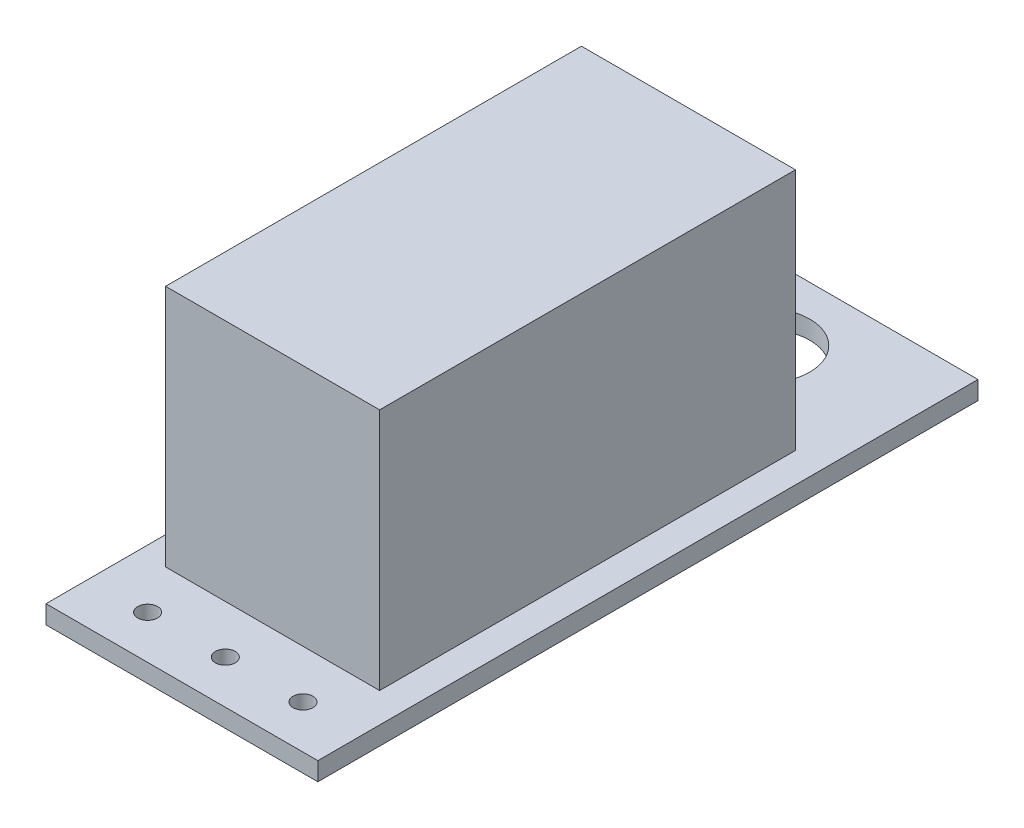
ISO-10303-21;
HEADER;
FILE_DESCRIPTION(('STEP AP214'),'2;1');
FILE_NAME('part.step','',(''),(''),'','','');
FILE_SCHEMA(('AUTOMOTIVE_DESIGN { 1 0 10303 214 1 1 1 1 }'));
ENDSEC;
DATA;
#1=APPLICATION_CONTEXT('core data for automotive mechanical design processes');
#2=APPLICATION_PROTOCOL_DEFINITION('international standard','automotive_design',2000,#1);
#3=PRODUCT_CONTEXT('',#1,'mechanical');
#4=PRODUCT('Part','Part','',(#3));
#5=PRODUCT_RELATED_PRODUCT_CATEGORY('part','',(#4));
#6=PRODUCT_DEFINITION_FORMATION('','',#4);
#7=PRODUCT_DEFINITION_CONTEXT('part definition',#1,'design');
#8=PRODUCT_DEFINITION('design','',#6,#7);
#9=PRODUCT_DEFINITION_SHAPE('','',#8);
#10=(LENGTH_UNIT() NAMED_UNIT(*) SI_UNIT(.MILLI.,.METRE.));
#11=(NAMED_UNIT(*) PLANE_ANGLE_UNIT() SI_UNIT($,.RADIAN.));
#12=(NAMED_UNIT(*) SI_UNIT($,.STERADIAN.) SOLID_ANGLE_UNIT());
#13=UNCERTAINTY_MEASURE_WITH_UNIT(LENGTH_MEASURE(1.E-05),#10,'distance_accuracy_value','');
#14=(GEOMETRIC_REPRESENTATION_CONTEXT(3) GLOBAL_UNCERTAINTY_ASSIGNED_CONTEXT((#13)) GLOBAL_UNIT_ASSIGNED_CONTEXT((#10,
#11,#12)) REPRESENTATION_CONTEXT('',''));
#15=CARTESIAN_POINT('',(0.,0.,0.));
#16=DIRECTION('',(0.,0.,1.));
#17=DIRECTION('',(1.,0.,0.));
#18=AXIS2_PLACEMENT_3D('',#15,#16,#17);
#19=CARTESIAN_POINT('',(3.5,7.95,6.8));
#20=DIRECTION('',(-1.,0.,0.));
#21=DIRECTION('',(0.,0.,1.));
#22=AXIS2_PLACEMENT_3D('',#19,#20,#21);
#23=PLANE('',#22);
#24=DIRECTION('',(0.,0.,-1.));
#25=VECTOR('',#24,1.);
#26=CARTESIAN_POINT('',(3.5,0.,6.8));
#27=LINE('',#26,#25);
#28=CARTESIAN_POINT('',(3.5,0.,6.8));
#29=VERTEX_POINT('',#28);
#30=CARTESIAN_POINT('',(3.5,0.,-6.8));
#31=VERTEX_POINT('',#30);
#32=EDGE_CURVE('E118',#29,#31,#27,.T.);
#33=ORIENTED_EDGE('',*,*,#32,.T.);
#34=DIRECTION('',(0.,-1.,0.));
#35=VECTOR('',#34,1.);
#36=CARTESIAN_POINT('',(3.5,7.95,-6.8));
#37=LINE('',#36,#35);
#38=CARTESIAN_POINT('',(3.5,7.95,-6.8));
#39=VERTEX_POINT('',#38);
#40=EDGE_CURVE('E11',#39,#31,#37,.T.);
#41=ORIENTED_EDGE('',*,*,#40,.F.);
#42=DIRECTION('',(0.,0.,-1.));
#43=VECTOR('',#42,1.);
#44=CARTESIAN_POINT('',(3.5,7.95,6.8));
#45=LINE('',#44,#43);
#46=CARTESIAN_POINT('',(3.5,7.95,6.8));
#47=VERTEX_POINT('',#46);
#48=EDGE_CURVE('E127',#47,#39,#45,.T.);
#49=ORIENTED_EDGE('',*,*,#48,.F.);
#50=DIRECTION('',(0.,-1.,0.));
#51=VECTOR('',#50,1.);
#52=CARTESIAN_POINT('',(3.5,7.95,6.8));
#53=LINE('',#52,#51);
#54=EDGE_CURVE('E134',#47,#29,#53,.T.);
#55=ORIENTED_EDGE('',*,*,#54,.T.);
#56=EDGE_LOOP('',(#33,#41,#49,#55));
#57=FACE_BOUND('',#56,.T.);
#58=ADVANCED_FACE('F32',(#57),#23,.F.);
#59=CARTESIAN_POINT('',(-3.5,7.95,-6.8));
#60=DIRECTION('',(0.,0.,1.));
#61=DIRECTION('',(1.,0.,0.));
#62=AXIS2_PLACEMENT_3D('',#59,#60,#61);
#63=PLANE('',#62);
#64=DIRECTION('',(-1.,0.,0.));
#65=VECTOR('',#64,1.);
#66=CARTESIAN_POINT('',(-3.5,0.,-6.8));
#67=LINE('',#66,#65);
#68=CARTESIAN_POINT('',(-3.5,0.,-6.8));
#69=VERTEX_POINT('',#68);
#70=EDGE_CURVE('E121',#31,#69,#67,.T.);
#71=ORIENTED_EDGE('',*,*,#70,.T.);
#72=DIRECTION('',(0.,-1.,0.));
#73=VECTOR('',#72,1.);
#74=CARTESIAN_POINT('',(-3.5,7.95,-6.8));
#75=LINE('',#74,#73);
#76=CARTESIAN_POINT('',(-3.5,7.95,-6.8));
#77=VERTEX_POINT('',#76);
#78=EDGE_CURVE('E40',#77,#69,#75,.T.);
#79=ORIENTED_EDGE('',*,*,#78,.F.);
#80=DIRECTION('',(-1.,0.,0.));
#81=VECTOR('',#80,1.);
#82=CARTESIAN_POINT('',(-3.5,7.95,-6.8));
#83=LINE('',#82,#81);
#84=EDGE_CURVE('E129',#39,#77,#83,.T.);
#85=ORIENTED_EDGE('',*,*,#84,.F.);
#86=ORIENTED_EDGE('',*,*,#40,.T.);
#87=EDGE_LOOP('',(#71,#79,#85,#86));
#88=FACE_BOUND('',#87,.T.);
#89=ADVANCED_FACE('F154',(#88),#63,.F.);
#90=CARTESIAN_POINT('',(-3.5,7.95,6.8));
#91=DIRECTION('',(1.,0.,0.));
#92=DIRECTION('',(0.,0.,-1.));
#93=AXIS2_PLACEMENT_3D('',#90,#91,#92);
#94=PLANE('',#93);
#95=DIRECTION('',(0.,0.,1.));
#96=VECTOR('',#95,1.);
#97=CARTESIAN_POINT('',(-3.5,0.,6.8));
#98=LINE('',#97,#96);
#99=CARTESIAN_POINT('',(-3.5,0.,6.8));
#100=VERTEX_POINT('',#99);
#101=EDGE_CURVE('E138',#69,#100,#98,.T.);
#102=ORIENTED_EDGE('',*,*,#101,.T.);
#103=DIRECTION('',(0.,-1.,0.));
#104=VECTOR('',#103,1.);
#105=CARTESIAN_POINT('',(-3.5,7.95,6.8));
#106=LINE('',#105,#104);
#107=CARTESIAN_POINT('',(-3.5,7.95,6.8));
#108=VERTEX_POINT('',#107);
#109=EDGE_CURVE('E145',#108,#100,#106,.T.);
#110=ORIENTED_EDGE('',*,*,#109,.F.);
#111=DIRECTION('',(0.,0.,1.));
#112=VECTOR('',#111,1.);
#113=CARTESIAN_POINT('',(-3.5,7.95,6.8));
#114=LINE('',#113,#112);
#115=EDGE_CURVE('E132',#77,#108,#114,.T.);
#116=ORIENTED_EDGE('',*,*,#115,.F.);
#117=ORIENTED_EDGE('',*,*,#78,.T.);
#118=EDGE_LOOP('',(#102,#110,#116,#117));
#119=FACE_BOUND('',#118,.T.);
#120=ADVANCED_FACE('F151',(#119),#94,.F.);
#121=CARTESIAN_POINT('',(-3.5,7.95,6.8));
#122=DIRECTION('',(0.,0.,-1.));
#123=DIRECTION('',(-1.,0.,0.));
#124=AXIS2_PLACEMENT_3D('',#121,#122,#123);
#125=PLANE('',#124);
#126=DIRECTION('',(1.,0.,0.));
#127=VECTOR('',#126,1.);
#128=CARTESIAN_POINT('',(-3.5,0.,6.8));
#129=LINE('',#128,#127);
#130=EDGE_CURVE('E130',#100,#29,#129,.T.);
#131=ORIENTED_EDGE('',*,*,#130,.T.);
#132=ORIENTED_EDGE('',*,*,#54,.F.);
#133=DIRECTION('',(1.,0.,0.));
#134=VECTOR('',#133,1.);
#135=CARTESIAN_POINT('',(-3.5,7.95,6.8));
#136=LINE('',#135,#134);
#137=EDGE_CURVE('E47',#108,#47,#136,.T.);
#138=ORIENTED_EDGE('',*,*,#137,.F.);
#139=ORIENTED_EDGE('',*,*,#109,.T.);
#140=EDGE_LOOP('',(#131,#132,#138,#139));
#141=FACE_BOUND('',#140,.T.);
#142=ADVANCED_FACE('F160',(#141),#125,.F.);
#143=CARTESIAN_POINT('',(0.,7.95,0.));
#144=DIRECTION('',(0.,-1.,0.));
#145=DIRECTION('',(0.,0.,-1.));
#146=AXIS2_PLACEMENT_3D('',#143,#144,#145);
#147=PLANE('',#146);
#148=ORIENTED_EDGE('',*,*,#48,.T.);
#149=ORIENTED_EDGE('',*,*,#84,.T.);
#150=ORIENTED_EDGE('',*,*,#115,.T.);
#151=ORIENTED_EDGE('',*,*,#137,.T.);
#152=EDGE_LOOP('',(#148,#149,#150,#151));
#153=FACE_BOUND('',#152,.T.);
#154=ADVANCED_FACE('F163',(#153),#147,.F.);
#155=CARTESIAN_POINT('',(0.,0.,0.));
#156=DIRECTION('',(0.,-1.,0.));
#157=DIRECTION('',(0.,0.,-1.));
#158=AXIS2_PLACEMENT_3D('',#155,#156,#157);
#159=PLANE('',#158);
#160=DIRECTION('',(0.,0.,1.));
#161=VECTOR('',#160,1.);
#162=CARTESIAN_POINT('',(4.47444532179176,0.,9.79543360749544));
#163=LINE('',#162,#161);
#164=CARTESIAN_POINT('',(4.47444532179177,0.,-11.7945663925046));
#165=VERTEX_POINT('',#164);
#166=CARTESIAN_POINT('',(4.47444532179176,0.,9.79543360749544));
#167=VERTEX_POINT('',#166);
#168=EDGE_CURVE('E117',#165,#167,#163,.T.);
#169=ORIENTED_EDGE('',*,*,#168,.F.);
#170=DIRECTION('',(1.,0.,0.));
#171=VECTOR('',#170,1.);
#172=CARTESIAN_POINT('',(-4.41555467820823,0.,-11.7945663925046));
#173=LINE('',#172,#171);
#174=CARTESIAN_POINT('',(-4.41555467820823,0.,-11.7945663925046));
#175=VERTEX_POINT('',#174);
#176=EDGE_CURVE('E113',#175,#165,#173,.T.);
#177=ORIENTED_EDGE('',*,*,#176,.F.);
#178=DIRECTION('',(0.,0.,-1.));
#179=VECTOR('',#178,1.);
#180=CARTESIAN_POINT('',(-4.41555467820824,0.,9.79543360749544));
#181=LINE('',#180,#179);
#182=CARTESIAN_POINT('',(-4.41555467820824,0.,9.79543360749544));
#183=VERTEX_POINT('',#182);
#184=EDGE_CURVE('E318',#183,#175,#181,.T.);
#185=ORIENTED_EDGE('',*,*,#184,.F.);
#186=DIRECTION('',(-1.,0.,0.));
#187=VECTOR('',#186,1.);
#188=CARTESIAN_POINT('',(-4.41555467820824,0.,9.79543360749544));
#189=LINE('',#188,#187);
#190=EDGE_CURVE('E316',#167,#183,#189,.T.);
#191=ORIENTED_EDGE('',*,*,#190,.F.);
#192=EDGE_LOOP('',(#169,#177,#185,#191));
#193=FACE_BOUND('',#192,.T.);
#194=CARTESIAN_POINT('',(0.0150112496129703,0.,-9.25456639250456));
#195=DIRECTION('',(0.,-1.,0.));
#196=DIRECTION('',(0.,0.,-1.));
#197=AXIS2_PLACEMENT_3D('',#194,#195,#196);
#198=CIRCLE('',#197,1.5);
#199=CARTESIAN_POINT('',(0.0150112496129703,0.,-10.7545663925046));
#200=VERTEX_POINT('',#199);
#201=EDGE_CURVE('E304',#200,#200,#198,.T.);
#202=ORIENTED_EDGE('',*,*,#201,.T.);
#203=EDGE_LOOP('',(#202));
#204=FACE_BOUND('',#203,.T.);
#205=CARTESIAN_POINT('',(0.0294453217917632,0.,8.37656057136997));
#206=DIRECTION('',(0.,-1.,0.));
#207=DIRECTION('',(0.,0.,-1.));
#208=AXIS2_PLACEMENT_3D('',#205,#206,#207);
#209=CIRCLE('',#208,0.325000000000001);
#210=CARTESIAN_POINT('',(0.0294453217917632,0.,8.05156057136997));
#211=VERTEX_POINT('',#210);
#212=EDGE_CURVE('E298',#211,#211,#209,.T.);
#213=ORIENTED_EDGE('',*,*,#212,.T.);
#214=EDGE_LOOP('',(#213));
#215=FACE_BOUND('',#214,.T.);
#216=CARTESIAN_POINT('',(2.56944532179176,0.,8.37656057136997));
#217=DIRECTION('',(0.,-1.,0.));
#218=DIRECTION('',(0.,0.,-1.));
#219=AXIS2_PLACEMENT_3D('',#216,#217,#218);
#220=CIRCLE('',#219,0.325000000000001);
#221=CARTESIAN_POINT('',(2.56944532179176,0.,8.05156057136997));
#222=VERTEX_POINT('',#221);
#223=EDGE_CURVE('E292',#222,#222,#220,.T.);
#224=ORIENTED_EDGE('',*,*,#223,.T.);
#225=EDGE_LOOP('',(#224));
#226=FACE_BOUND('',#225,.T.);
#227=CARTESIAN_POINT('',(-2.51055467820824,0.,8.37656057136997));
#228=DIRECTION('',(0.,-1.,0.));
#229=DIRECTION('',(0.,0.,-1.));
#230=AXIS2_PLACEMENT_3D('',#227,#228,#229);
#231=CIRCLE('',#230,0.325000000000001);
#232=CARTESIAN_POINT('',(-2.51055467820824,0.,8.05156057136997));
#233=VERTEX_POINT('',#232);
#234=EDGE_CURVE('E289',#233,#233,#231,.T.);
#235=ORIENTED_EDGE('',*,*,#234,.T.);
#236=EDGE_LOOP('',(#235));
#237=FACE_BOUND('',#236,.T.);
#238=ORIENTED_EDGE('',*,*,#70,.F.);
#239=ORIENTED_EDGE('',*,*,#32,.F.);
#240=ORIENTED_EDGE('',*,*,#130,.F.);
#241=ORIENTED_EDGE('',*,*,#101,.F.);
#242=EDGE_LOOP('',(#238,#239,#240,#241));
#243=FACE_BOUND('',#242,.T.);
#244=ADVANCED_FACE('F158',(#193,#204,#215,#226,#237,#243),#159,.F.);
#245=CARTESIAN_POINT('',(0.,-0.6,0.));
#246=DIRECTION('',(0.,-1.,0.));
#247=DIRECTION('',(0.,0.,-1.));
#248=AXIS2_PLACEMENT_3D('',#245,#246,#247);
#249=PLANE('',#248);
#250=CARTESIAN_POINT('',(2.56944532179176,-0.6,8.37656057136997));
#251=DIRECTION('',(0.,-1.,0.));
#252=DIRECTION('',(0.,0.,-1.));
#253=AXIS2_PLACEMENT_3D('',#250,#251,#252);
#254=CIRCLE('',#253,0.325000000000001);
#255=CARTESIAN_POINT('',(2.56944532179176,-0.6,8.05156057136997));
#256=VERTEX_POINT('',#255);
#257=EDGE_CURVE('E295',#256,#256,#254,.T.);
#258=ORIENTED_EDGE('',*,*,#257,.F.);
#259=EDGE_LOOP('',(#258));
#260=FACE_BOUND('',#259,.T.);
#261=CARTESIAN_POINT('',(0.0150112496129703,-0.6,-9.25456639250456));
#262=DIRECTION('',(0.,-1.,0.));
#263=DIRECTION('',(0.,0.,-1.));
#264=AXIS2_PLACEMENT_3D('',#261,#262,#263);
#265=CIRCLE('',#264,1.5);
#266=CARTESIAN_POINT('',(0.0150112496129703,-0.6,-10.7545663925046));
#267=VERTEX_POINT('',#266);
#268=EDGE_CURVE('E307',#267,#267,#265,.T.);
#269=ORIENTED_EDGE('',*,*,#268,.F.);
#270=EDGE_LOOP('',(#269));
#271=FACE_BOUND('',#270,.T.);
#272=DIRECTION('',(0.,0.,1.));
#273=VECTOR('',#272,1.);
#274=CARTESIAN_POINT('',(4.47444532179176,-0.6,9.79543360749544));
#275=LINE('',#274,#273);
#276=CARTESIAN_POINT('',(4.47444532179177,-0.6,-11.7945663925046));
#277=VERTEX_POINT('',#276);
#278=CARTESIAN_POINT('',(4.47444532179176,-0.6,9.79543360749544));
#279=VERTEX_POINT('',#278);
#280=EDGE_CURVE('E103',#277,#279,#275,.T.);
#281=ORIENTED_EDGE('',*,*,#280,.T.);
#282=DIRECTION('',(-1.,0.,0.));
#283=VECTOR('',#282,1.);
#284=CARTESIAN_POINT('',(-4.41555467820824,-0.6,9.79543360749544));
#285=LINE('',#284,#283);
#286=CARTESIAN_POINT('',(-4.41555467820824,-0.6,9.79543360749544));
#287=VERTEX_POINT('',#286);
#288=EDGE_CURVE('E92',#279,#287,#285,.T.);
#289=ORIENTED_EDGE('',*,*,#288,.T.);
#290=DIRECTION('',(0.,0.,-1.));
#291=VECTOR('',#290,1.);
#292=CARTESIAN_POINT('',(-4.41555467820824,-0.6,9.79543360749544));
#293=LINE('',#292,#291);
#294=CARTESIAN_POINT('',(-4.41555467820823,-0.6,-11.7945663925046));
#295=VERTEX_POINT('',#294);
#296=EDGE_CURVE('E102',#287,#295,#293,.T.);
#297=ORIENTED_EDGE('',*,*,#296,.T.);
#298=DIRECTION('',(1.,0.,0.));
#299=VECTOR('',#298,1.);
#300=CARTESIAN_POINT('',(-4.41555467820823,-0.6,-11.7945663925046));
#301=LINE('',#300,#299);
#302=EDGE_CURVE('E109',#295,#277,#301,.T.);
#303=ORIENTED_EDGE('',*,*,#302,.T.);
#304=EDGE_LOOP('',(#281,#289,#297,#303));
#305=FACE_BOUND('',#304,.T.);
#306=CARTESIAN_POINT('',(0.0294453217917632,-0.6,8.37656057136997));
#307=DIRECTION('',(0.,-1.,0.));
#308=DIRECTION('',(0.,0.,-1.));
#309=AXIS2_PLACEMENT_3D('',#306,#307,#308);
#310=CIRCLE('',#309,0.325000000000001);
#311=CARTESIAN_POINT('',(0.0294453217917632,-0.6,8.05156057136997));
#312=VERTEX_POINT('',#311);
#313=EDGE_CURVE('E301',#312,#312,#310,.T.);
#314=ORIENTED_EDGE('',*,*,#313,.F.);
#315=EDGE_LOOP('',(#314));
#316=FACE_BOUND('',#315,.T.);
#317=CARTESIAN_POINT('',(-2.51055467820824,-0.6,8.37656057136997));
#318=DIRECTION('',(0.,-1.,0.));
#319=DIRECTION('',(0.,0.,-1.));
#320=AXIS2_PLACEMENT_3D('',#317,#318,#319);
#321=CIRCLE('',#320,0.325000000000001);
#322=CARTESIAN_POINT('',(-2.51055467820824,-0.6,8.05156057136997));
#323=VERTEX_POINT('',#322);
#324=EDGE_CURVE('E286',#323,#323,#321,.T.);
#325=ORIENTED_EDGE('',*,*,#324,.F.);
#326=EDGE_LOOP('',(#325));
#327=FACE_BOUND('',#326,.T.);
#328=ADVANCED_FACE('F106',(#260,#271,#305,#316,#327),#249,.T.);
#329=CARTESIAN_POINT('',(4.47444532179176,-0.6,9.79543360749544));
#330=DIRECTION('',(-1.,0.,0.));
#331=DIRECTION('',(0.,0.,1.));
#332=AXIS2_PLACEMENT_3D('',#329,#330,#331);
#333=PLANE('',#332);
#334=ORIENTED_EDGE('',*,*,#168,.T.);
#335=DIRECTION('',(0.,1.,0.));
#336=VECTOR('',#335,1.);
#337=CARTESIAN_POINT('',(4.47444532179176,-0.6,9.79543360749544));
#338=LINE('',#337,#336);
#339=EDGE_CURVE('E96',#279,#167,#338,.T.);
#340=ORIENTED_EDGE('',*,*,#339,.F.);
#341=ORIENTED_EDGE('',*,*,#280,.F.);
#342=DIRECTION('',(0.,1.,0.));
#343=VECTOR('',#342,1.);
#344=CARTESIAN_POINT('',(4.47444532179177,-0.6,-11.7945663925046));
#345=LINE('',#344,#343);
#346=EDGE_CURVE('E314',#277,#165,#345,.T.);
#347=ORIENTED_EDGE('',*,*,#346,.T.);
#348=EDGE_LOOP('',(#334,#340,#341,#347));
#349=FACE_BOUND('',#348,.T.);
#350=ADVANCED_FACE('F115',(#349),#333,.F.);
#351=CARTESIAN_POINT('',(-4.41555467820824,-0.6,9.79543360749544));
#352=DIRECTION('',(0.,0.,-1.));
#353=DIRECTION('',(-1.,0.,0.));
#354=AXIS2_PLACEMENT_3D('',#351,#352,#353);
#355=PLANE('',#354);
#356=ORIENTED_EDGE('',*,*,#190,.T.);
#357=DIRECTION('',(0.,1.,0.));
#358=VECTOR('',#357,1.);
#359=CARTESIAN_POINT('',(-4.41555467820824,-0.6,9.79543360749544));
#360=LINE('',#359,#358);
#361=EDGE_CURVE('E99',#287,#183,#360,.T.);
#362=ORIENTED_EDGE('',*,*,#361,.F.);
#363=ORIENTED_EDGE('',*,*,#288,.F.);
#364=ORIENTED_EDGE('',*,*,#339,.T.);
#365=EDGE_LOOP('',(#356,#362,#363,#364));
#366=FACE_BOUND('',#365,.T.);
#367=ADVANCED_FACE('F94',(#366),#355,.F.);
#368=CARTESIAN_POINT('',(-4.41555467820824,-0.6,9.79543360749544));
#369=DIRECTION('',(1.,0.,0.));
#370=DIRECTION('',(0.,0.,-1.));
#371=AXIS2_PLACEMENT_3D('',#368,#369,#370);
#372=PLANE('',#371);
#373=ORIENTED_EDGE('',*,*,#184,.T.);
#374=DIRECTION('',(0.,1.,0.));
#375=VECTOR('',#374,1.);
#376=CARTESIAN_POINT('',(-4.41555467820823,-0.6,-11.7945663925046));
#377=LINE('',#376,#375);
#378=EDGE_CURVE('E123',#295,#175,#377,.T.);
#379=ORIENTED_EDGE('',*,*,#378,.F.);
#380=ORIENTED_EDGE('',*,*,#296,.F.);
#381=ORIENTED_EDGE('',*,*,#361,.T.);
#382=EDGE_LOOP('',(#373,#379,#380,#381));
#383=FACE_BOUND('',#382,.T.);
#384=ADVANCED_FACE('F220',(#383),#372,.F.);
#385=CARTESIAN_POINT('',(-4.41555467820823,-0.6,-11.7945663925046));
#386=DIRECTION('',(0.,0.,1.));
#387=DIRECTION('',(1.,0.,0.));
#388=AXIS2_PLACEMENT_3D('',#385,#386,#387);
#389=PLANE('',#388);
#390=ORIENTED_EDGE('',*,*,#176,.T.);
#391=ORIENTED_EDGE('',*,*,#346,.F.);
#392=ORIENTED_EDGE('',*,*,#302,.F.);
#393=ORIENTED_EDGE('',*,*,#378,.T.);
#394=EDGE_LOOP('',(#390,#391,#392,#393));
#395=FACE_BOUND('',#394,.T.);
#396=ADVANCED_FACE('F229',(#395),#389,.F.);
#397=CARTESIAN_POINT('',(0.0150112496129703,-0.6,-9.25456639250456));
#398=DIRECTION('',(0.,1.,0.));
#399=DIRECTION('',(0.,0.,1.));
#400=AXIS2_PLACEMENT_3D('',#397,#398,#399);
#401=CYLINDRICAL_SURFACE('',#400,1.5);
#402=ORIENTED_EDGE('',*,*,#268,.T.);
#403=EDGE_LOOP('',(#402));
#404=FACE_BOUND('',#403,.T.);
#405=ORIENTED_EDGE('',*,*,#201,.F.);
#406=EDGE_LOOP('',(#405));
#407=FACE_BOUND('',#406,.T.);
#408=ADVANCED_FACE('F239',(#404,#407),#401,.F.);
#409=CARTESIAN_POINT('',(0.0294453217917632,-0.6,8.37656057136997));
#410=DIRECTION('',(0.,1.,0.));
#411=DIRECTION('',(0.,0.,1.));
#412=AXIS2_PLACEMENT_3D('',#409,#410,#411);
#413=CYLINDRICAL_SURFACE('',#412,0.325000000000001);
#414=ORIENTED_EDGE('',*,*,#313,.T.);
#415=EDGE_LOOP('',(#414));
#416=FACE_BOUND('',#415,.T.);
#417=ORIENTED_EDGE('',*,*,#212,.F.);
#418=EDGE_LOOP('',(#417));
#419=FACE_BOUND('',#418,.T.);
#420=ADVANCED_FACE('F249',(#416,#419),#413,.F.);
#421=CARTESIAN_POINT('',(2.56944532179176,-0.6,8.37656057136997));
#422=DIRECTION('',(0.,1.,0.));
#423=DIRECTION('',(0.,0.,1.));
#424=AXIS2_PLACEMENT_3D('',#421,#422,#423);
#425=CYLINDRICAL_SURFACE('',#424,0.325000000000001);
#426=ORIENTED_EDGE('',*,*,#257,.T.);
#427=EDGE_LOOP('',(#426));
#428=FACE_BOUND('',#427,.T.);
#429=ORIENTED_EDGE('',*,*,#223,.F.);
#430=EDGE_LOOP('',(#429));
#431=FACE_BOUND('',#430,.T.);
#432=ADVANCED_FACE('F259',(#428,#431),#425,.F.);
#433=CARTESIAN_POINT('',(-2.51055467820824,-0.6,8.37656057136997));
#434=DIRECTION('',(0.,1.,0.));
#435=DIRECTION('',(0.,0.,1.));
#436=AXIS2_PLACEMENT_3D('',#433,#434,#435);
#437=CYLINDRICAL_SURFACE('',#436,0.325000000000001);
#438=ORIENTED_EDGE('',*,*,#324,.T.);
#439=EDGE_LOOP('',(#438));
#440=FACE_BOUND('',#439,.T.);
#441=ORIENTED_EDGE('',*,*,#234,.F.);
#442=EDGE_LOOP('',(#441));
#443=FACE_BOUND('',#442,.T.);
#444=ADVANCED_FACE('F269',(#440,#443),#437,.F.);
#445=CLOSED_SHELL('',(#58,#89,#120,#142,#154,#244,#328,#350,#367,#384,#396,#408,#420,#432,#444));
#446=MANIFOLD_SOLID_BREP('B2',#445);
#447=ADVANCED_BREP_SHAPE_REPRESENTATION('',(#18,#446),#14);
#448=SHAPE_DEFINITION_REPRESENTATION(#9,#447);
ENDSEC;
END-ISO-10303-21;
